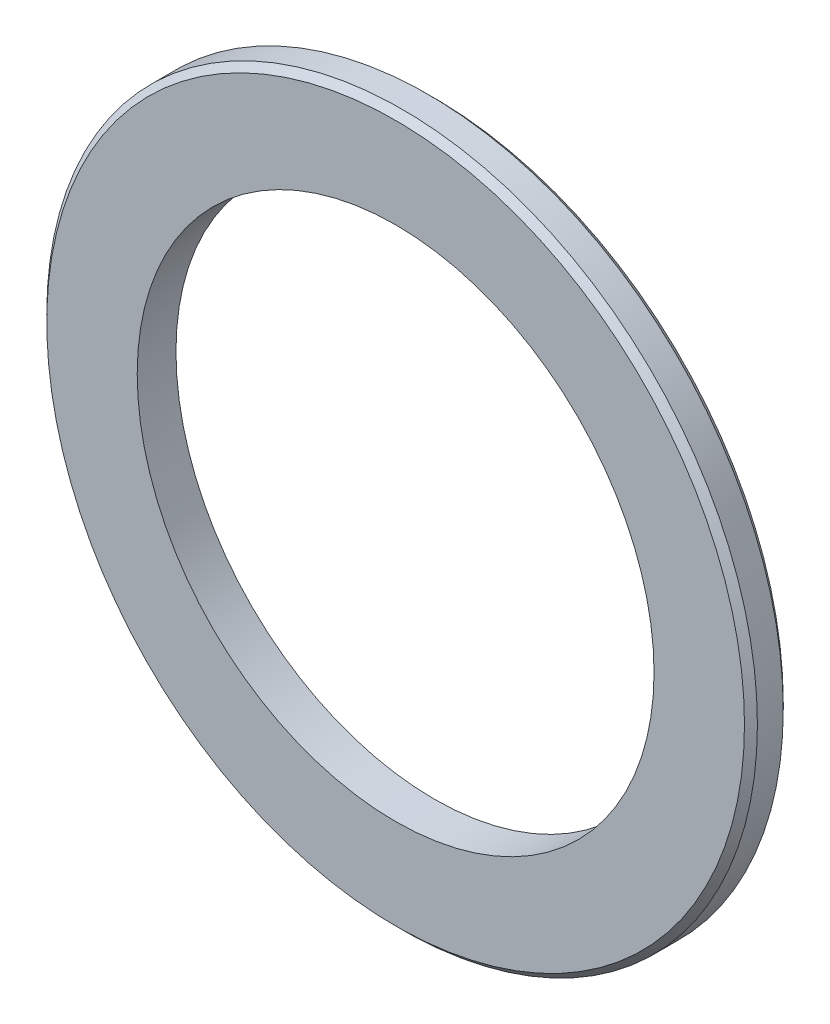
ISO-10303-21;
HEADER;
FILE_DESCRIPTION(('STEP AP214'),'2;1');
FILE_NAME('part.step','',(''),(''),'','','');
FILE_SCHEMA(('AUTOMOTIVE_DESIGN { 1 0 10303 214 1 1 1 1 }'));
ENDSEC;
DATA;
#1=APPLICATION_CONTEXT('core data for automotive mechanical design processes');
#2=APPLICATION_PROTOCOL_DEFINITION('international standard','automotive_design',2000,#1);
#3=PRODUCT_CONTEXT('',#1,'mechanical');
#4=PRODUCT('Part','Part','',(#3));
#5=PRODUCT_RELATED_PRODUCT_CATEGORY('part','',(#4));
#6=PRODUCT_DEFINITION_FORMATION('','',#4);
#7=PRODUCT_DEFINITION_CONTEXT('part definition',#1,'design');
#8=PRODUCT_DEFINITION('design','',#6,#7);
#9=PRODUCT_DEFINITION_SHAPE('','',#8);
#10=(LENGTH_UNIT() NAMED_UNIT(*) SI_UNIT(.MILLI.,.METRE.));
#11=(NAMED_UNIT(*) PLANE_ANGLE_UNIT() SI_UNIT($,.RADIAN.));
#12=(NAMED_UNIT(*) SI_UNIT($,.STERADIAN.) SOLID_ANGLE_UNIT());
#13=UNCERTAINTY_MEASURE_WITH_UNIT(LENGTH_MEASURE(1.E-05),#10,'distance_accuracy_value','');
#14=(GEOMETRIC_REPRESENTATION_CONTEXT(3) GLOBAL_UNCERTAINTY_ASSIGNED_CONTEXT((#13)) GLOBAL_UNIT_ASSIGNED_CONTEXT((#10,
#11,#12)) REPRESENTATION_CONTEXT('',''));
#15=CARTESIAN_POINT('',(0.,0.,0.));
#16=DIRECTION('',(0.,0.,1.));
#17=DIRECTION('',(1.,0.,0.));
#18=AXIS2_PLACEMENT_3D('',#15,#16,#17);
#19=CARTESIAN_POINT('',(0.,0.,3.));
#20=DIRECTION('',(0.,0.,1.));
#21=DIRECTION('',(1.,0.,0.));
#22=AXIS2_PLACEMENT_3D('',#19,#20,#21);
#23=PLANE('',#22);
#24=CARTESIAN_POINT('',(0.,0.,3.));
#25=DIRECTION('',(0.,0.,1.));
#26=DIRECTION('',(1.,0.,0.));
#27=AXIS2_PLACEMENT_3D('',#24,#25,#26);
#28=CIRCLE('',#27,27.);
#29=CARTESIAN_POINT('',(27.,0.,3.));
#30=VERTEX_POINT('',#29);
#31=EDGE_CURVE('E10',#30,#30,#28,.T.);
#32=ORIENTED_EDGE('',*,*,#31,.T.);
#33=EDGE_LOOP('',(#32));
#34=FACE_BOUND('',#33,.T.);
#35=CARTESIAN_POINT('',(0.,0.,3.));
#36=DIRECTION('',(0.,0.,1.));
#37=DIRECTION('',(1.,0.,0.));
#38=AXIS2_PLACEMENT_3D('',#35,#36,#37);
#39=CIRCLE('',#38,20.);
#40=CARTESIAN_POINT('',(20.,0.,3.));
#41=VERTEX_POINT('',#40);
#42=EDGE_CURVE('E61',#41,#41,#39,.T.);
#43=ORIENTED_EDGE('',*,*,#42,.F.);
#44=EDGE_LOOP('',(#43));
#45=FACE_BOUND('',#44,.T.);
#46=ADVANCED_FACE('F41',(#34,#45),#23,.T.);
#47=CARTESIAN_POINT('',(0.,0.,0.));
#48=DIRECTION('',(0.,0.,1.));
#49=DIRECTION('',(1.,0.,0.));
#50=AXIS2_PLACEMENT_3D('',#47,#48,#49);
#51=PLANE('',#50);
#52=CARTESIAN_POINT('',(0.,0.,0.));
#53=DIRECTION('',(0.,0.,1.));
#54=DIRECTION('',(1.,0.,0.));
#55=AXIS2_PLACEMENT_3D('',#52,#53,#54);
#56=CIRCLE('',#55,27.);
#57=CARTESIAN_POINT('',(27.,0.,0.));
#58=VERTEX_POINT('',#57);
#59=EDGE_CURVE('E47',#58,#58,#56,.F.);
#60=ORIENTED_EDGE('',*,*,#59,.T.);
#61=EDGE_LOOP('',(#60));
#62=FACE_BOUND('',#61,.T.);
#63=CARTESIAN_POINT('',(0.,0.,0.));
#64=DIRECTION('',(0.,0.,1.));
#65=DIRECTION('',(1.,0.,0.));
#66=AXIS2_PLACEMENT_3D('',#63,#64,#65);
#67=CIRCLE('',#66,20.);
#68=CARTESIAN_POINT('',(20.,0.,0.));
#69=VERTEX_POINT('',#68);
#70=EDGE_CURVE('E65',#69,#69,#67,.T.);
#71=ORIENTED_EDGE('',*,*,#70,.T.);
#72=EDGE_LOOP('',(#71));
#73=FACE_BOUND('',#72,.T.);
#74=ADVANCED_FACE('F75',(#62,#73),#51,.F.);
#75=CARTESIAN_POINT('',(0.,0.,3.));
#76=DIRECTION('',(0.,0.,-1.));
#77=DIRECTION('',(-1.,0.,0.));
#78=AXIS2_PLACEMENT_3D('',#75,#76,#77);
#79=CYLINDRICAL_SURFACE('',#78,27.5);
#80=CARTESIAN_POINT('',(0.,0.,0.500000000000007));
#81=DIRECTION('',(0.,0.,1.));
#82=DIRECTION('',(1.,0.,0.));
#83=AXIS2_PLACEMENT_3D('',#80,#81,#82);
#84=CIRCLE('',#83,27.5);
#85=CARTESIAN_POINT('',(27.5,0.,0.500000000000007));
#86=VERTEX_POINT('',#85);
#87=EDGE_CURVE('E52',#86,#86,#84,.T.);
#88=ORIENTED_EDGE('',*,*,#87,.T.);
#89=EDGE_LOOP('',(#88));
#90=FACE_BOUND('',#89,.T.);
#91=CARTESIAN_POINT('',(0.,0.,2.49999999999999));
#92=DIRECTION('',(0.,0.,1.));
#93=DIRECTION('',(1.,0.,0.));
#94=AXIS2_PLACEMENT_3D('',#91,#92,#93);
#95=CIRCLE('',#94,27.5);
#96=CARTESIAN_POINT('',(27.5,0.,2.49999999999999));
#97=VERTEX_POINT('',#96);
#98=EDGE_CURVE('E60',#97,#97,#95,.F.);
#99=ORIENTED_EDGE('',*,*,#98,.T.);
#100=EDGE_LOOP('',(#99));
#101=FACE_BOUND('',#100,.T.);
#102=ADVANCED_FACE('F79',(#90,#101),#79,.T.);
#103=CARTESIAN_POINT('',(0.,0.,3.));
#104=DIRECTION('',(0.,0.,-1.));
#105=DIRECTION('',(-1.,0.,0.));
#106=AXIS2_PLACEMENT_3D('',#103,#104,#105);
#107=CYLINDRICAL_SURFACE('',#106,20.);
#108=ORIENTED_EDGE('',*,*,#42,.T.);
#109=EDGE_LOOP('',(#108));
#110=FACE_BOUND('',#109,.T.);
#111=ORIENTED_EDGE('',*,*,#70,.F.);
#112=EDGE_LOOP('',(#111));
#113=FACE_BOUND('',#112,.T.);
#114=ADVANCED_FACE('F69',(#110,#113),#107,.F.);
#115=CARTESIAN_POINT('',(0.,0.,0.500000000000007));
#116=DIRECTION('',(0.,0.,1.));
#117=DIRECTION('',(1.,0.,0.));
#118=AXIS2_PLACEMENT_3D('',#115,#116,#117);
#119=CONICAL_SURFACE('',#118,27.5,0.785398163397452);
#120=ORIENTED_EDGE('',*,*,#59,.F.);
#121=EDGE_LOOP('',(#120));
#122=FACE_BOUND('',#121,.T.);
#123=ORIENTED_EDGE('',*,*,#87,.F.);
#124=EDGE_LOOP('',(#123));
#125=FACE_BOUND('',#124,.T.);
#126=ADVANCED_FACE('F87',(#122,#125),#119,.T.);
#127=CARTESIAN_POINT('',(0.,0.,3.));
#128=DIRECTION('',(0.,0.,-1.));
#129=DIRECTION('',(-1.,0.,0.));
#130=AXIS2_PLACEMENT_3D('',#127,#128,#129);
#131=CONICAL_SURFACE('',#130,27.,0.785398163397448);
#132=ORIENTED_EDGE('',*,*,#98,.F.);
#133=EDGE_LOOP('',(#132));
#134=FACE_BOUND('',#133,.T.);
#135=ORIENTED_EDGE('',*,*,#31,.F.);
#136=EDGE_LOOP('',(#135));
#137=FACE_BOUND('',#136,.T.);
#138=ADVANCED_FACE('F42',(#134,#137),#131,.T.);
#139=CLOSED_SHELL('',(#46,#74,#102,#114,#126,#138));
#140=MANIFOLD_SOLID_BREP('B2',#139);
#141=ADVANCED_BREP_SHAPE_REPRESENTATION('',(#18,#140),#14);
#142=SHAPE_DEFINITION_REPRESENTATION(#9,#141);
ENDSEC;
END-ISO-10303-21;
